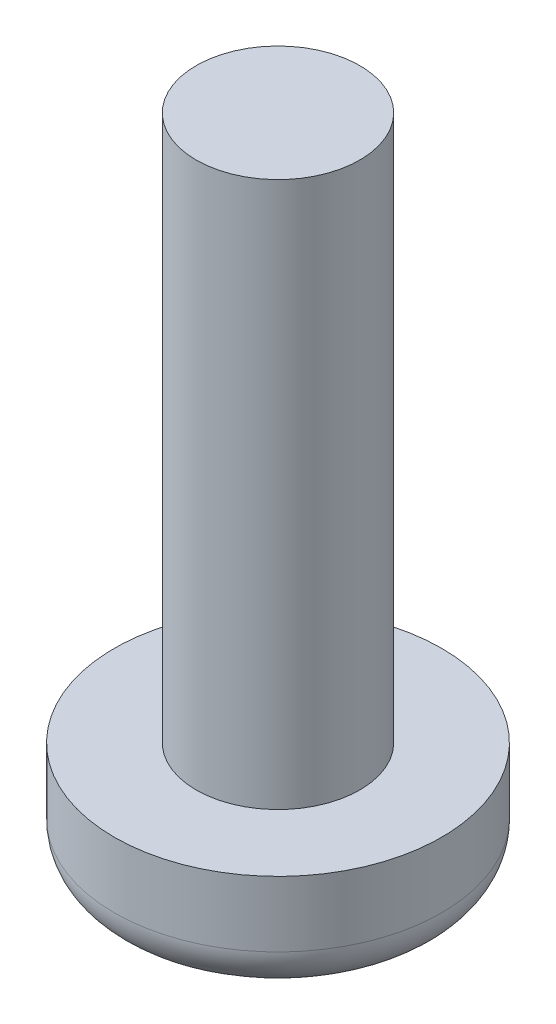
ISO-10303-21;
HEADER;
FILE_DESCRIPTION(('STEP AP214'),'2;1');
FILE_NAME('part.step','',(''),(''),'','','');
FILE_SCHEMA(('AUTOMOTIVE_DESIGN { 1 0 10303 214 1 1 1 1 }'));
ENDSEC;
DATA;
#1=APPLICATION_CONTEXT('core data for automotive mechanical design processes');
#2=APPLICATION_PROTOCOL_DEFINITION('international standard','automotive_design',2000,#1);
#3=PRODUCT_CONTEXT('',#1,'mechanical');
#4=PRODUCT('Part','Part','',(#3));
#5=PRODUCT_RELATED_PRODUCT_CATEGORY('part','',(#4));
#6=PRODUCT_DEFINITION_FORMATION('','',#4);
#7=PRODUCT_DEFINITION_CONTEXT('part definition',#1,'design');
#8=PRODUCT_DEFINITION('design','',#6,#7);
#9=PRODUCT_DEFINITION_SHAPE('','',#8);
#10=(LENGTH_UNIT() NAMED_UNIT(*) SI_UNIT(.MILLI.,.METRE.));
#11=(NAMED_UNIT(*) PLANE_ANGLE_UNIT() SI_UNIT($,.RADIAN.));
#12=(NAMED_UNIT(*) SI_UNIT($,.STERADIAN.) SOLID_ANGLE_UNIT());
#13=UNCERTAINTY_MEASURE_WITH_UNIT(LENGTH_MEASURE(1.E-05),#10,'distance_accuracy_value','');
#14=(GEOMETRIC_REPRESENTATION_CONTEXT(3) GLOBAL_UNCERTAINTY_ASSIGNED_CONTEXT((#13)) GLOBAL_UNIT_ASSIGNED_CONTEXT((#10,
#11,#12)) REPRESENTATION_CONTEXT('',''));
#15=CARTESIAN_POINT('',(0.,0.,0.));
#16=DIRECTION('',(0.,0.,1.));
#17=DIRECTION('',(1.,0.,0.));
#18=AXIS2_PLACEMENT_3D('',#15,#16,#17);
#19=CARTESIAN_POINT('',(0.,-2.,0.));
#20=DIRECTION('',(0.,1.,0.));
#21=DIRECTION('',(0.,0.,1.));
#22=AXIS2_PLACEMENT_3D('',#19,#20,#21);
#23=CYLINDRICAL_SURFACE('',#22,3.);
#24=CARTESIAN_POINT('',(0.,-1.2,0.));
#25=DIRECTION('',(0.,1.,0.));
#26=DIRECTION('',(0.,0.,1.));
#27=AXIS2_PLACEMENT_3D('',#24,#25,#26);
#28=CIRCLE('',#27,3.);
#29=CARTESIAN_POINT('',(0.,-1.2,3.));
#30=VERTEX_POINT('',#29);
#31=EDGE_CURVE('E54',#30,#30,#28,.T.);
#32=ORIENTED_EDGE('',*,*,#31,.T.);
#33=EDGE_LOOP('',(#32));
#34=FACE_BOUND('',#33,.T.);
#35=CARTESIAN_POINT('',(0.,0.,0.));
#36=DIRECTION('',(0.,1.,0.));
#37=DIRECTION('',(0.,0.,1.));
#38=AXIS2_PLACEMENT_3D('',#35,#36,#37);
#39=CIRCLE('',#38,3.);
#40=CARTESIAN_POINT('',(0.,0.,3.));
#41=VERTEX_POINT('',#40);
#42=EDGE_CURVE('E58',#41,#41,#39,.T.);
#43=ORIENTED_EDGE('',*,*,#42,.F.);
#44=EDGE_LOOP('',(#43));
#45=FACE_BOUND('',#44,.T.);
#46=ADVANCED_FACE('F47',(#34,#45),#23,.T.);
#47=CARTESIAN_POINT('',(0.,-2.,0.));
#48=DIRECTION('',(0.,1.,0.));
#49=DIRECTION('',(0.,0.,1.));
#50=AXIS2_PLACEMENT_3D('',#47,#48,#49);
#51=PLANE('',#50);
#52=CARTESIAN_POINT('',(0.,-2.,0.));
#53=DIRECTION('',(0.,1.,0.));
#54=DIRECTION('',(0.,0.,1.));
#55=AXIS2_PLACEMENT_3D('',#52,#53,#54);
#56=CIRCLE('',#55,2.2);
#57=CARTESIAN_POINT('',(0.,-2.,2.2));
#58=VERTEX_POINT('',#57);
#59=EDGE_CURVE('E11',#58,#58,#56,.F.);
#60=ORIENTED_EDGE('',*,*,#59,.T.);
#61=EDGE_LOOP('',(#60));
#62=FACE_BOUND('',#61,.T.);
#63=ADVANCED_FACE('F68',(#62),#51,.F.);
#64=CARTESIAN_POINT('',(0.,0.,0.));
#65=DIRECTION('',(0.,1.,0.));
#66=DIRECTION('',(0.,0.,1.));
#67=AXIS2_PLACEMENT_3D('',#64,#65,#66);
#68=PLANE('',#67);
#69=ORIENTED_EDGE('',*,*,#42,.T.);
#70=EDGE_LOOP('',(#69));
#71=FACE_BOUND('',#70,.T.);
#72=ADVANCED_FACE('F65',(#71),#68,.T.);
#73=CARTESIAN_POINT('',(0.,-1.2,0.));
#74=DIRECTION('',(0.,1.,0.));
#75=DIRECTION('',(0.,0.,1.));
#76=AXIS2_PLACEMENT_3D('',#73,#74,#75);
#77=TOROIDAL_SURFACE('',#76,2.2,0.8);
#78=ORIENTED_EDGE('',*,*,#59,.F.);
#79=EDGE_LOOP('',(#78));
#80=FACE_BOUND('',#79,.T.);
#81=ORIENTED_EDGE('',*,*,#31,.F.);
#82=EDGE_LOOP('',(#81));
#83=FACE_BOUND('',#82,.T.);
#84=ADVANCED_FACE('F49',(#80,#83),#77,.T.);
#85=CLOSED_SHELL('',(#46,#63,#72,#84));
#86=MANIFOLD_SOLID_BREP('B2',#85);
#87=CARTESIAN_POINT('',(0.,10.,0.));
#88=DIRECTION('',(0.,-1.,0.));
#89=DIRECTION('',(0.,0.,-1.));
#90=AXIS2_PLACEMENT_3D('',#87,#88,#89);
#91=CYLINDRICAL_SURFACE('',#90,1.5);
#92=CARTESIAN_POINT('',(0.,10.,0.));
#93=DIRECTION('',(0.,1.,0.));
#94=DIRECTION('',(0.,0.,1.));
#95=AXIS2_PLACEMENT_3D('',#92,#93,#94);
#96=CIRCLE('',#95,1.5);
#97=CARTESIAN_POINT('',(0.,10.,1.5));
#98=VERTEX_POINT('',#97);
#99=EDGE_CURVE('E46',#98,#98,#96,.T.);
#100=ORIENTED_EDGE('',*,*,#99,.F.);
#101=EDGE_LOOP('',(#100));
#102=FACE_BOUND('',#101,.T.);
#103=CARTESIAN_POINT('',(0.,0.,0.));
#104=DIRECTION('',(0.,1.,0.));
#105=DIRECTION('',(0.,0.,1.));
#106=AXIS2_PLACEMENT_3D('',#103,#104,#105);
#107=CIRCLE('',#106,1.5);
#108=CARTESIAN_POINT('',(0.,0.,1.5));
#109=VERTEX_POINT('',#108);
#110=EDGE_CURVE('E106',#109,#109,#107,.T.);
#111=ORIENTED_EDGE('',*,*,#110,.T.);
#112=EDGE_LOOP('',(#111));
#113=FACE_BOUND('',#112,.T.);
#114=ADVANCED_FACE('F103',(#102,#113),#91,.T.);
#115=CARTESIAN_POINT('',(0.,10.,0.));
#116=DIRECTION('',(0.,1.,0.));
#117=DIRECTION('',(0.,0.,1.));
#118=AXIS2_PLACEMENT_3D('',#115,#116,#117);
#119=PLANE('',#118);
#120=ORIENTED_EDGE('',*,*,#99,.T.);
#121=EDGE_LOOP('',(#120));
#122=FACE_BOUND('',#121,.T.);
#123=ADVANCED_FACE('F118',(#122),#119,.T.);
#124=CARTESIAN_POINT('',(0.,0.,0.));
#125=DIRECTION('',(0.,1.,0.));
#126=DIRECTION('',(0.,0.,1.));
#127=AXIS2_PLACEMENT_3D('',#124,#125,#126);
#128=PLANE('',#127);
#129=ORIENTED_EDGE('',*,*,#110,.F.);
#130=EDGE_LOOP('',(#129));
#131=FACE_BOUND('',#130,.T.);
#132=ADVANCED_FACE('F116',(#131),#128,.F.);
#133=CLOSED_SHELL('',(#114,#123,#132));
#134=MANIFOLD_SOLID_BREP('B6',#133);
#135=ADVANCED_BREP_SHAPE_REPRESENTATION('',(#18,#86,#134),#14);
#136=SHAPE_DEFINITION_REPRESENTATION(#9,#135);
ENDSEC;
END-ISO-10303-21;
